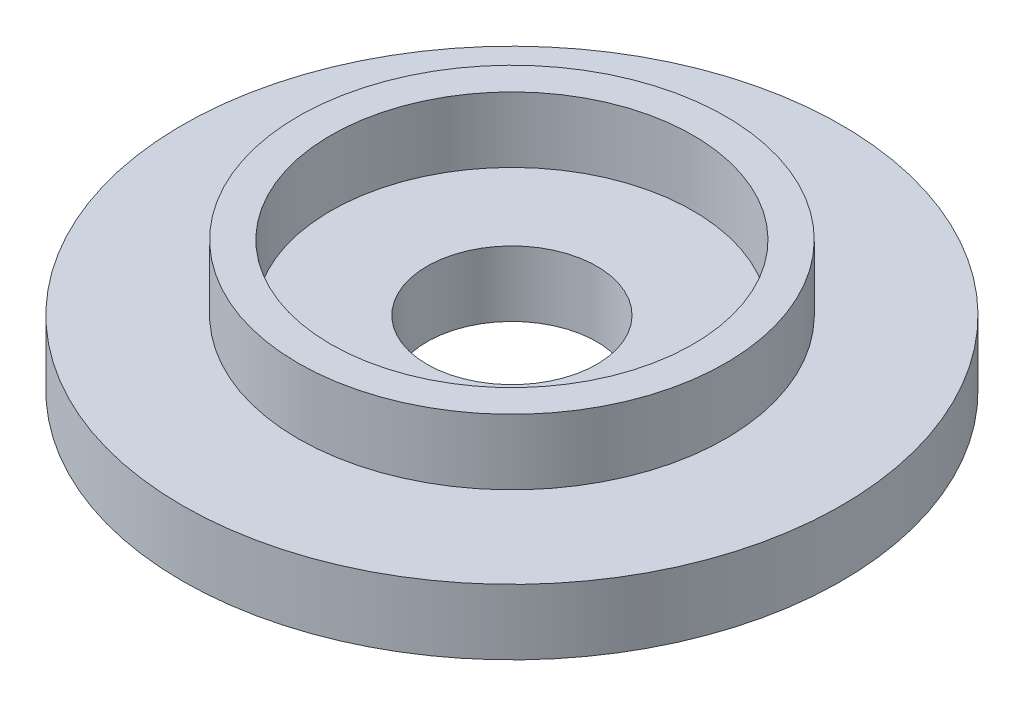
ISO-10303-21;
HEADER;
FILE_DESCRIPTION(('STEP AP214'),'2;1');
FILE_NAME('part.step','',(''),(''),'','','');
FILE_SCHEMA(('AUTOMOTIVE_DESIGN { 1 0 10303 214 1 1 1 1 }'));
ENDSEC;
DATA;
#1=APPLICATION_CONTEXT('core data for automotive mechanical design processes');
#2=APPLICATION_PROTOCOL_DEFINITION('international standard','automotive_design',2000,#1);
#3=PRODUCT_CONTEXT('',#1,'mechanical');
#4=PRODUCT('Part','Part','',(#3));
#5=PRODUCT_RELATED_PRODUCT_CATEGORY('part','',(#4));
#6=PRODUCT_DEFINITION_FORMATION('','',#4);
#7=PRODUCT_DEFINITION_CONTEXT('part definition',#1,'design');
#8=PRODUCT_DEFINITION('design','',#6,#7);
#9=PRODUCT_DEFINITION_SHAPE('','',#8);
#10=(LENGTH_UNIT() NAMED_UNIT(*) SI_UNIT(.MILLI.,.METRE.));
#11=(NAMED_UNIT(*) PLANE_ANGLE_UNIT() SI_UNIT($,.RADIAN.));
#12=(NAMED_UNIT(*) SI_UNIT($,.STERADIAN.) SOLID_ANGLE_UNIT());
#13=UNCERTAINTY_MEASURE_WITH_UNIT(LENGTH_MEASURE(1.E-05),#10,'distance_accuracy_value','');
#14=(GEOMETRIC_REPRESENTATION_CONTEXT(3) GLOBAL_UNCERTAINTY_ASSIGNED_CONTEXT((#13)) GLOBAL_UNIT_ASSIGNED_CONTEXT((#10,
#11,#12)) REPRESENTATION_CONTEXT('',''));
#15=CARTESIAN_POINT('',(0.,0.,0.));
#16=DIRECTION('',(0.,0.,1.));
#17=DIRECTION('',(1.,0.,0.));
#18=AXIS2_PLACEMENT_3D('',#15,#16,#17);
#19=CARTESIAN_POINT('',(0.,12.7,0.));
#20=DIRECTION('',(0.,-1.,0.));
#21=DIRECTION('',(0.,0.,-1.));
#22=AXIS2_PLACEMENT_3D('',#19,#20,#21);
#23=CYLINDRICAL_SURFACE('',#22,64.);
#24=CARTESIAN_POINT('',(0.,12.7,0.));
#25=DIRECTION('',(0.,1.,0.));
#26=DIRECTION('',(0.,0.,1.));
#27=AXIS2_PLACEMENT_3D('',#24,#25,#26);
#28=CIRCLE('',#27,64.);
#29=CARTESIAN_POINT('',(0.,12.7,64.));
#30=VERTEX_POINT('',#29);
#31=EDGE_CURVE('E38',#30,#30,#28,.T.);
#32=ORIENTED_EDGE('',*,*,#31,.F.);
#33=EDGE_LOOP('',(#32));
#34=FACE_BOUND('',#33,.T.);
#35=CARTESIAN_POINT('',(0.,0.,0.));
#36=DIRECTION('',(0.,1.,0.));
#37=DIRECTION('',(0.,0.,1.));
#38=AXIS2_PLACEMENT_3D('',#35,#36,#37);
#39=CIRCLE('',#38,64.);
#40=CARTESIAN_POINT('',(0.,0.,64.));
#41=VERTEX_POINT('',#40);
#42=EDGE_CURVE('E42',#41,#41,#39,.T.);
#43=ORIENTED_EDGE('',*,*,#42,.T.);
#44=EDGE_LOOP('',(#43));
#45=FACE_BOUND('',#44,.T.);
#46=ADVANCED_FACE('F31',(#34,#45),#23,.T.);
#47=CARTESIAN_POINT('',(0.,12.7,0.));
#48=DIRECTION('',(0.,1.,0.));
#49=DIRECTION('',(0.,0.,1.));
#50=AXIS2_PLACEMENT_3D('',#47,#48,#49);
#51=PLANE('',#50);
#52=CARTESIAN_POINT('',(0.,12.7,0.));
#53=DIRECTION('',(0.,1.,0.));
#54=DIRECTION('',(0.,0.,1.));
#55=AXIS2_PLACEMENT_3D('',#52,#53,#54);
#56=CIRCLE('',#55,41.5156920317028);
#57=CARTESIAN_POINT('',(0.,12.7,41.5156920317028));
#58=VERTEX_POINT('',#57);
#59=EDGE_CURVE('E48',#58,#58,#56,.T.);
#60=ORIENTED_EDGE('',*,*,#59,.F.);
#61=EDGE_LOOP('',(#60));
#62=FACE_BOUND('',#61,.T.);
#63=ORIENTED_EDGE('',*,*,#31,.T.);
#64=EDGE_LOOP('',(#63));
#65=FACE_BOUND('',#64,.T.);
#66=ADVANCED_FACE('F71',(#62,#65),#51,.T.);
#67=CARTESIAN_POINT('',(0.,0.,0.));
#68=DIRECTION('',(0.,1.,0.));
#69=DIRECTION('',(0.,0.,1.));
#70=AXIS2_PLACEMENT_3D('',#67,#68,#69);
#71=PLANE('',#70);
#72=CARTESIAN_POINT('',(0.,0.,0.));
#73=DIRECTION('',(0.,1.,0.));
#74=DIRECTION('',(0.,0.,1.));
#75=AXIS2_PLACEMENT_3D('',#72,#73,#74);
#76=CIRCLE('',#75,16.4981496443156);
#77=CARTESIAN_POINT('',(0.,0.,16.4981496443156));
#78=VERTEX_POINT('',#77);
#79=EDGE_CURVE('E56',#78,#78,#76,.T.);
#80=ORIENTED_EDGE('',*,*,#79,.T.);
#81=EDGE_LOOP('',(#80));
#82=FACE_BOUND('',#81,.T.);
#83=ORIENTED_EDGE('',*,*,#42,.F.);
#84=EDGE_LOOP('',(#83));
#85=FACE_BOUND('',#84,.T.);
#86=ADVANCED_FACE('F82',(#82,#85),#71,.F.);
#87=CARTESIAN_POINT('',(0.,25.4,0.));
#88=DIRECTION('',(0.,1.,0.));
#89=DIRECTION('',(0.,0.,1.));
#90=AXIS2_PLACEMENT_3D('',#87,#88,#89);
#91=PLANE('',#90);
#92=CARTESIAN_POINT('',(0.,25.4,0.));
#93=DIRECTION('',(0.,1.,0.));
#94=DIRECTION('',(0.,0.,1.));
#95=AXIS2_PLACEMENT_3D('',#92,#93,#94);
#96=CIRCLE('',#95,41.5156920317028);
#97=CARTESIAN_POINT('',(0.,25.4,41.5156920317028));
#98=VERTEX_POINT('',#97);
#99=EDGE_CURVE('E46',#98,#98,#96,.T.);
#100=ORIENTED_EDGE('',*,*,#99,.T.);
#101=EDGE_LOOP('',(#100));
#102=FACE_BOUND('',#101,.T.);
#103=CARTESIAN_POINT('',(0.,25.4,0.));
#104=DIRECTION('',(0.,1.,0.));
#105=DIRECTION('',(0.,0.,1.));
#106=AXIS2_PLACEMENT_3D('',#103,#104,#105);
#107=CIRCLE('',#106,35.1656920317028);
#108=CARTESIAN_POINT('',(0.,25.4,35.1656920317028));
#109=VERTEX_POINT('',#108);
#110=EDGE_CURVE('E51',#109,#109,#107,.T.);
#111=ORIENTED_EDGE('',*,*,#110,.F.);
#112=EDGE_LOOP('',(#111));
#113=FACE_BOUND('',#112,.T.);
#114=ADVANCED_FACE('F93',(#102,#113),#91,.T.);
#115=CARTESIAN_POINT('',(0.,25.4,0.));
#116=DIRECTION('',(0.,-1.,0.));
#117=DIRECTION('',(0.,0.,-1.));
#118=AXIS2_PLACEMENT_3D('',#115,#116,#117);
#119=CYLINDRICAL_SURFACE('',#118,41.5156920317028);
#120=ORIENTED_EDGE('',*,*,#99,.F.);
#121=EDGE_LOOP('',(#120));
#122=FACE_BOUND('',#121,.T.);
#123=ORIENTED_EDGE('',*,*,#59,.T.);
#124=EDGE_LOOP('',(#123));
#125=FACE_BOUND('',#124,.T.);
#126=ADVANCED_FACE('F77',(#122,#125),#119,.T.);
#127=CARTESIAN_POINT('',(0.,25.4,0.));
#128=DIRECTION('',(0.,-1.,0.));
#129=DIRECTION('',(0.,0.,-1.));
#130=AXIS2_PLACEMENT_3D('',#127,#128,#129);
#131=CYLINDRICAL_SURFACE('',#130,35.1656920317028);
#132=ORIENTED_EDGE('',*,*,#110,.T.);
#133=EDGE_LOOP('',(#132));
#134=FACE_BOUND('',#133,.T.);
#135=CARTESIAN_POINT('',(0.,12.7,0.));
#136=DIRECTION('',(0.,1.,0.));
#137=DIRECTION('',(0.,0.,1.));
#138=AXIS2_PLACEMENT_3D('',#135,#136,#137);
#139=CIRCLE('',#138,35.1656920317028);
#140=CARTESIAN_POINT('',(0.,12.7,35.1656920317028));
#141=VERTEX_POINT('',#140);
#142=EDGE_CURVE('E10',#141,#141,#139,.F.);
#143=ORIENTED_EDGE('',*,*,#142,.T.);
#144=EDGE_LOOP('',(#143));
#145=FACE_BOUND('',#144,.T.);
#146=ADVANCED_FACE('F69',(#134,#145),#131,.F.);
#147=CARTESIAN_POINT('',(0.,12.7,0.));
#148=DIRECTION('',(0.,1.,0.));
#149=DIRECTION('',(0.,0.,1.));
#150=AXIS2_PLACEMENT_3D('',#147,#148,#149);
#151=CIRCLE('',#150,16.4981496443156);
#152=CARTESIAN_POINT('',(0.,12.6999999999999,16.4981496443156));
#153=VERTEX_POINT('',#152);
#154=EDGE_CURVE('E34',#153,#153,#151,.T.);
#155=ORIENTED_EDGE('',*,*,#154,.F.);
#156=EDGE_LOOP('',(#155));
#157=FACE_BOUND('',#156,.T.);
#158=ORIENTED_EDGE('',*,*,#142,.F.);
#159=EDGE_LOOP('',(#158));
#160=FACE_BOUND('',#159,.T.);
#161=ADVANCED_FACE('F66',(#157,#160),#51,.T.);
#162=CARTESIAN_POINT('',(0.,-609.6,0.));
#163=DIRECTION('',(0.,1.,0.));
#164=DIRECTION('',(0.,0.,1.));
#165=AXIS2_PLACEMENT_3D('',#162,#163,#164);
#166=CYLINDRICAL_SURFACE('',#165,16.4981496443156);
#167=CARTESIAN_POINT('',(0.,12.6999999999999,16.4981496443156));
#168=CARTESIAN_POINT('',(0.,12.5677083333333,16.4981496443156));
#169=CARTESIAN_POINT('',(0.,12.4354166666666,16.4981496443156));
#170=CARTESIAN_POINT('',(0.,12.1708333333333,16.4981496443156));
#171=CARTESIAN_POINT('',(0.,12.0385416666666,16.4981496443156));
#172=CARTESIAN_POINT('',(0.,11.7739583333332,16.4981496443156));
#173=CARTESIAN_POINT('',(0.,11.6416666666666,16.4981496443156));
#174=CARTESIAN_POINT('',(0.,11.3770833333333,16.4981496443156));
#175=CARTESIAN_POINT('',(0.,11.2447916666666,16.4981496443156));
#176=CARTESIAN_POINT('',(0.,10.9802083333333,16.4981496443156));
#177=CARTESIAN_POINT('',(0.,10.8479166666666,16.4981496443156));
#178=CARTESIAN_POINT('',(0.,10.5833333333332,16.4981496443156));
#179=CARTESIAN_POINT('',(0.,10.4510416666666,16.4981496443156));
#180=CARTESIAN_POINT('',(0.,10.1864583333333,16.4981496443156));
#181=CARTESIAN_POINT('',(0.,10.0541666666666,16.4981496443156));
#182=CARTESIAN_POINT('',(0.,9.78958333333332,16.4981496443156));
#183=CARTESIAN_POINT('',(0.,9.65729166666666,16.4981496443156));
#184=CARTESIAN_POINT('',(0.,9.39270833333331,16.4981496443156));
#185=CARTESIAN_POINT('',(0.,9.26041666666662,16.4981496443156));
#186=CARTESIAN_POINT('',(0.,8.99583333333328,16.4981496443156));
#187=CARTESIAN_POINT('',(0.,8.86354166666662,16.4981496443156));
#188=CARTESIAN_POINT('',(0.,8.59895833333331,16.4981496443156));
#189=CARTESIAN_POINT('',(0.,8.46666666666666,16.4981496443156));
#190=CARTESIAN_POINT('',(0.,8.20208333333331,16.4981496443156));
#191=CARTESIAN_POINT('',(0.,8.06979166666662,16.4981496443156));
#192=CARTESIAN_POINT('',(0.,7.80520833333328,16.4981496443156));
#193=CARTESIAN_POINT('',(0.,7.67291666666662,16.4981496443156));
#194=CARTESIAN_POINT('',(0.,7.40833333333331,16.4981496443156));
#195=CARTESIAN_POINT('',(0.,7.27604166666666,16.4981496443156));
#196=CARTESIAN_POINT('',(0.,7.01145833333331,16.4981496443156));
#197=CARTESIAN_POINT('',(0.,6.87916666666662,16.4981496443156));
#198=CARTESIAN_POINT('',(0.,6.61458333333328,16.4981496443156));
#199=CARTESIAN_POINT('',(0.,6.48229166666662,16.4981496443156));
#200=CARTESIAN_POINT('',(0.,6.21770833333331,16.4981496443156));
#201=CARTESIAN_POINT('',(0.,6.08541666666666,16.4981496443156));
#202=CARTESIAN_POINT('',(0.,5.82083333333331,16.4981496443156));
#203=CARTESIAN_POINT('',(0.,5.68854166666662,16.4981496443156));
#204=CARTESIAN_POINT('',(0.,5.42395833333327,16.4981496443156));
#205=CARTESIAN_POINT('',(0.,5.29166666666662,16.4981496443156));
#206=CARTESIAN_POINT('',(0.,5.02708333333331,16.4981496443156));
#207=CARTESIAN_POINT('',(0.,4.89479166666666,16.4981496443156));
#208=CARTESIAN_POINT('',(0.,4.63020833333331,16.4981496443156));
#209=CARTESIAN_POINT('',(0.,4.49791666666662,16.4981496443156));
#210=CARTESIAN_POINT('',(0.,4.23333333333327,16.4981496443156));
#211=CARTESIAN_POINT('',(0.,4.10104166666662,16.4981496443156));
#212=CARTESIAN_POINT('',(0.,3.83645833333331,16.4981496443156));
#213=CARTESIAN_POINT('',(0.,3.70416666666666,16.4981496443156));
#214=CARTESIAN_POINT('',(0.,3.43958333333331,16.4981496443156));
#215=CARTESIAN_POINT('',(0.,3.30729166666662,16.4981496443156));
#216=CARTESIAN_POINT('',(0.,3.04270833333327,16.4981496443156));
#217=CARTESIAN_POINT('',(0.,2.91041666666662,16.4981496443156));
#218=CARTESIAN_POINT('',(0.,2.64583333333331,16.4981496443156));
#219=CARTESIAN_POINT('',(0.,2.51354166666666,16.4981496443156));
#220=CARTESIAN_POINT('',(0.,2.24895833333335,16.4981496443156));
#221=CARTESIAN_POINT('',(0.,2.11666666666669,16.4981496443156));
#222=CARTESIAN_POINT('',(0.,1.85208333333335,16.4981496443156));
#223=CARTESIAN_POINT('',(0.,1.71979166666666,16.4981496443156));
#224=CARTESIAN_POINT('',(0.,1.45520833333331,16.4981496443156));
#225=CARTESIAN_POINT('',(0.,1.32291666666666,16.4981496443156));
#226=CARTESIAN_POINT('',(0.,1.05833333333335,16.4981496443156));
#227=CARTESIAN_POINT('',(0.,0.926041666666692,16.4981496443156));
#228=CARTESIAN_POINT('',(0.,0.661458333333346,16.4981496443156));
#229=CARTESIAN_POINT('',(0.,0.529166666666655,16.4981496443156));
#230=CARTESIAN_POINT('',(0.,0.264583333333309,16.4981496443156));
#231=CARTESIAN_POINT('',(0.,0.132291666666654,16.4981496443156));
#232=CARTESIAN_POINT('',(0.,0.,16.4981496443156));
#233=B_SPLINE_CURVE_WITH_KNOTS('',3,(#167,#168,#169,#170,#171,#172,#173,#174,#175,#176,#177,
#178,#179,#180,#181,#182,#183,#184,#185,#186,#187,#188,#189,#190,#191,#192,#193,#194,#195,#196,
#197,#198,#199,#200,#201,#202,#203,#204,#205,#206,#207,#208,#209,#210,#211,#212,#213,#214,#215,
#216,#217,#218,#219,#220,#221,#222,#223,#224,#225,#226,#227,#228,#229,#230,#231,#232),
.UNSPECIFIED.,.F.,.F.,(4,2,2,2,2,2,2,2,2,2,2,2,2,2,2,2,2,2,2,2,2,2,2,2,2,2,2,2,2,2,2,2,4),(0.,
0.396874999999963,0.793750000000037,1.190625,1.58749999999996,1.98437500000004,2.38125,
2.77812499999996,3.17499999999993,3.571875,3.96874999999997,4.36562499999993,4.7625,
5.15937499999997,5.55624999999993,5.953125,6.34999999999997,6.74687499999993,7.14375,
7.54062499999997,7.93749999999993,8.334375,8.73124999999997,9.12812499999993,9.52500000000001,
9.92187499999997,10.3187499999999,10.7156249999999,11.1125,11.5093749999999,11.9062499999999,
12.303125,12.6999999999999),.UNSPECIFIED.);
#234=EDGE_CURVE('BSEAM63',#153,#78,#233,.T.);
#235=ORIENTED_EDGE('',*,*,#154,.T.);
#236=ORIENTED_EDGE('',*,*,#79,.F.);
#237=ORIENTED_EDGE('',*,*,#234,.T.);
#238=ORIENTED_EDGE('',*,*,#234,.F.);
#239=EDGE_LOOP('',(#235,#237,#236,#238));
#240=FACE_BOUND('',#239,.T.);
#241=ADVANCED_FACE('F63',(#240),#166,.F.);
#242=CLOSED_SHELL('',(#46,#66,#86,#114,#126,#146,#161,#241));
#243=MANIFOLD_SOLID_BREP('B2',#242);
#244=ADVANCED_BREP_SHAPE_REPRESENTATION('',(#18,#243),#14);
#245=SHAPE_DEFINITION_REPRESENTATION(#9,#244);
ENDSEC;
END-ISO-10303-21;
